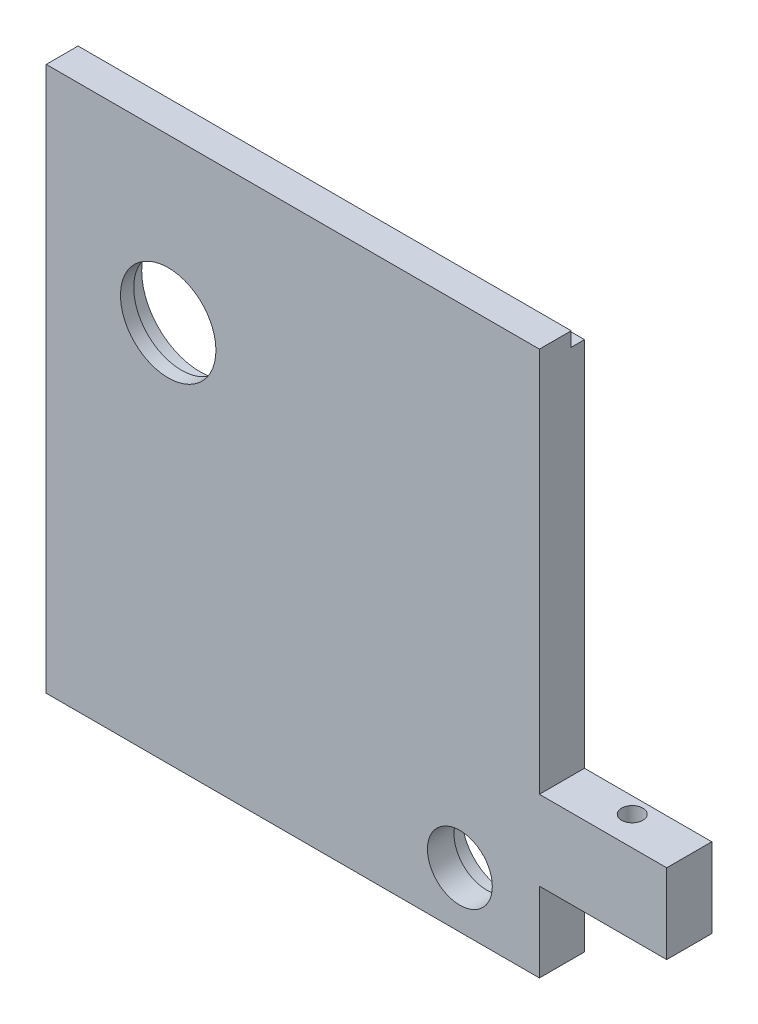
ISO-10303-21;
HEADER;
FILE_DESCRIPTION(('STEP AP214'),'2;1');
FILE_NAME('part.step','',(''),(''),'','','');
FILE_SCHEMA(('AUTOMOTIVE_DESIGN { 1 0 10303 214 1 1 1 1 }'));
ENDSEC;
DATA;
#1=APPLICATION_CONTEXT('core data for automotive mechanical design processes');
#2=APPLICATION_PROTOCOL_DEFINITION('international standard','automotive_design',2000,#1);
#3=PRODUCT_CONTEXT('',#1,'mechanical');
#4=PRODUCT('Part','Part','',(#3));
#5=PRODUCT_RELATED_PRODUCT_CATEGORY('part','',(#4));
#6=PRODUCT_DEFINITION_FORMATION('','',#4);
#7=PRODUCT_DEFINITION_CONTEXT('part definition',#1,'design');
#8=PRODUCT_DEFINITION('design','',#6,#7);
#9=PRODUCT_DEFINITION_SHAPE('','',#8);
#10=(LENGTH_UNIT() NAMED_UNIT(*) SI_UNIT(.MILLI.,.METRE.));
#11=(NAMED_UNIT(*) PLANE_ANGLE_UNIT() SI_UNIT($,.RADIAN.));
#12=(NAMED_UNIT(*) SI_UNIT($,.STERADIAN.) SOLID_ANGLE_UNIT());
#13=UNCERTAINTY_MEASURE_WITH_UNIT(LENGTH_MEASURE(1.E-05),#10,'distance_accuracy_value','');
#14=(GEOMETRIC_REPRESENTATION_CONTEXT(3) GLOBAL_UNCERTAINTY_ASSIGNED_CONTEXT((#13)) GLOBAL_UNIT_ASSIGNED_CONTEXT((#10,
#11,#12)) REPRESENTATION_CONTEXT('',''));
#15=CARTESIAN_POINT('',(0.,0.,0.));
#16=DIRECTION('',(0.,0.,1.));
#17=DIRECTION('',(1.,0.,0.));
#18=AXIS2_PLACEMENT_3D('',#15,#16,#17);
#19=CARTESIAN_POINT('',(1.81294964028777,-24.5719424460432,47.5));
#20=DIRECTION('',(0.,0.,-1.));
#21=DIRECTION('',(-1.,0.,0.));
#22=AXIS2_PLACEMENT_3D('',#19,#20,#21);
#23=CYLINDRICAL_SURFACE('',#22,8.115);
#24=CARTESIAN_POINT('',(1.81294964028777,-24.5719424460432,-2.5));
#25=DIRECTION('',(0.,0.,-1.));
#26=DIRECTION('',(-1.,0.,0.));
#27=AXIS2_PLACEMENT_3D('',#24,#25,#26);
#28=CIRCLE('',#27,8.115);
#29=CARTESIAN_POINT('',(-6.30205035971223,-24.5719424460432,-2.5));
#30=VERTEX_POINT('',#29);
#31=EDGE_CURVE('E310',#30,#30,#28,.T.);
#32=ORIENTED_EDGE('',*,*,#31,.T.);
#33=EDGE_LOOP('',(#32));
#34=FACE_BOUND('',#33,.T.);
#35=CARTESIAN_POINT('',(1.81294964028777,-24.5719424460432,1.));
#36=DIRECTION('',(0.,0.,1.));
#37=DIRECTION('',(1.,0.,0.));
#38=AXIS2_PLACEMENT_3D('',#35,#36,#37);
#39=CIRCLE('',#38,8.115);
#40=CARTESIAN_POINT('',(9.92794964028778,-24.5719424460432,1.));
#41=VERTEX_POINT('',#40);
#42=EDGE_CURVE('E12',#41,#41,#39,.F.);
#43=ORIENTED_EDGE('',*,*,#42,.F.);
#44=EDGE_LOOP('',(#43));
#45=FACE_BOUND('',#44,.T.);
#46=ADVANCED_FACE('F47',(#34,#45),#23,.F.);
#47=CARTESIAN_POINT('',(-53.1870503597122,36.9280575539568,50.));
#48=DIRECTION('',(0.,0.,-1.));
#49=DIRECTION('',(-1.,0.,0.));
#50=AXIS2_PLACEMENT_3D('',#47,#48,#49);
#51=CYLINDRICAL_SURFACE('',#50,11.);
#52=CARTESIAN_POINT('',(-53.1870503597122,36.9280575539568,0.));
#53=DIRECTION('',(0.,0.,-1.));
#54=DIRECTION('',(-1.,0.,0.));
#55=AXIS2_PLACEMENT_3D('',#52,#53,#54);
#56=CIRCLE('',#55,11.);
#57=CARTESIAN_POINT('',(-64.1870503597122,36.9280575539568,0.));
#58=VERTEX_POINT('',#57);
#59=EDGE_CURVE('E313',#58,#58,#56,.T.);
#60=ORIENTED_EDGE('',*,*,#59,.T.);
#61=EDGE_LOOP('',(#60));
#62=FACE_BOUND('',#61,.T.);
#63=CARTESIAN_POINT('',(-53.1870503597122,36.9280575539568,3.5));
#64=DIRECTION('',(0.,0.,1.));
#65=DIRECTION('',(1.,0.,0.));
#66=AXIS2_PLACEMENT_3D('',#63,#64,#65);
#67=CIRCLE('',#66,11.);
#68=CARTESIAN_POINT('',(-42.1870503597123,36.9280575539568,3.5));
#69=VERTEX_POINT('',#68);
#70=EDGE_CURVE('E55',#69,#69,#67,.F.);
#71=ORIENTED_EDGE('',*,*,#70,.F.);
#72=EDGE_LOOP('',(#71));
#73=FACE_BOUND('',#72,.T.);
#74=ADVANCED_FACE('F219',(#62,#73),#51,.F.);
#75=CARTESIAN_POINT('',(16.8129496402878,67.6280575539569,6.));
#76=DIRECTION('',(1.,0.,0.));
#77=DIRECTION('',(0.,1.,0.));
#78=AXIS2_PLACEMENT_3D('',#75,#76,#77);
#79=PLANE('',#78);
#80=DIRECTION('',(0.,0.,1.));
#81=VECTOR('',#80,1.);
#82=CARTESIAN_POINT('',(16.8129496402878,-5.07194244604315,6.));
#83=LINE('',#82,#81);
#84=CARTESIAN_POINT('',(16.8129496402878,-5.07194244604316,-2.5));
#85=VERTEX_POINT('',#84);
#86=CARTESIAN_POINT('',(16.8129496402878,-5.07194244604316,6.));
#87=VERTEX_POINT('',#86);
#88=EDGE_CURVE('E62',#85,#87,#83,.T.);
#89=ORIENTED_EDGE('',*,*,#88,.F.);
#90=DIRECTION('',(0.,-1.,0.));
#91=VECTOR('',#90,1.);
#92=CARTESIAN_POINT('',(16.8129496402878,64.9280575539568,-2.5));
#93=LINE('',#92,#91);
#94=CARTESIAN_POINT('',(16.8129496402878,64.9280575539568,-2.5));
#95=VERTEX_POINT('',#94);
#96=EDGE_CURVE('E165',#95,#85,#93,.T.);
#97=ORIENTED_EDGE('',*,*,#96,.F.);
#98=DIRECTION('',(0.,0.,1.));
#99=VECTOR('',#98,1.);
#100=CARTESIAN_POINT('',(16.8129496402878,64.9280575539568,-2.5));
#101=LINE('',#100,#99);
#102=CARTESIAN_POINT('',(16.8129496402878,64.9280575539568,0.));
#103=VERTEX_POINT('',#102);
#104=EDGE_CURVE('E173',#95,#103,#101,.T.);
#105=ORIENTED_EDGE('',*,*,#104,.T.);
#106=DIRECTION('',(0.,-1.,0.));
#107=VECTOR('',#106,1.);
#108=CARTESIAN_POINT('',(16.8129496402878,67.6280575539569,0.));
#109=LINE('',#108,#107);
#110=CARTESIAN_POINT('',(16.8129496402878,67.6280575539569,0.));
#111=VERTEX_POINT('',#110);
#112=EDGE_CURVE('E202',#111,#103,#109,.T.);
#113=ORIENTED_EDGE('',*,*,#112,.F.);
#114=DIRECTION('',(0.,0.,-1.));
#115=VECTOR('',#114,1.);
#116=CARTESIAN_POINT('',(16.8129496402878,67.6280575539569,6.));
#117=LINE('',#116,#115);
#118=CARTESIAN_POINT('',(16.8129496402878,67.6280575539569,6.));
#119=VERTEX_POINT('',#118);
#120=EDGE_CURVE('E207',#119,#111,#117,.T.);
#121=ORIENTED_EDGE('',*,*,#120,.F.);
#122=DIRECTION('',(0.,-1.,0.));
#123=VECTOR('',#122,1.);
#124=CARTESIAN_POINT('',(16.8129496402878,67.6280575539569,6.));
#125=LINE('',#124,#123);
#126=EDGE_CURVE('E191',#119,#87,#125,.T.);
#127=ORIENTED_EDGE('',*,*,#126,.T.);
#128=EDGE_LOOP('',(#89,#97,#105,#113,#121,#127));
#129=FACE_BOUND('',#128,.T.);
#130=ADVANCED_FACE('F221',(#129),#79,.T.);
#131=CARTESIAN_POINT('',(0.,0.,0.));
#132=DIRECTION('',(0.,0.,1.));
#133=DIRECTION('',(1.,0.,0.));
#134=AXIS2_PLACEMENT_3D('',#131,#132,#133);
#135=PLANE('',#134);
#136=ORIENTED_EDGE('',*,*,#59,.F.);
#137=EDGE_LOOP('',(#136));
#138=FACE_BOUND('',#137,.T.);
#139=DIRECTION('',(1.,0.,0.));
#140=VECTOR('',#139,1.);
#141=CARTESIAN_POINT('',(16.8129496402878,64.9280575539568,0.));
#142=LINE('',#141,#140);
#143=CARTESIAN_POINT('',(-18.1870503597122,64.9280575539568,0.));
#144=VERTEX_POINT('',#143);
#145=EDGE_CURVE('E159',#144,#103,#142,.T.);
#146=ORIENTED_EDGE('',*,*,#145,.F.);
#147=DIRECTION('',(0.,1.,0.));
#148=VECTOR('',#147,1.);
#149=CARTESIAN_POINT('',(-18.1870503597122,64.9280575539568,0.));
#150=LINE('',#149,#148);
#151=CARTESIAN_POINT('',(-18.1870503597123,-35.0719424460432,0.));
#152=VERTEX_POINT('',#151);
#153=EDGE_CURVE('E156',#152,#144,#150,.T.);
#154=ORIENTED_EDGE('',*,*,#153,.F.);
#155=DIRECTION('',(1.,0.,0.));
#156=VECTOR('',#155,1.);
#157=CARTESIAN_POINT('',(-76.1870503597122,-35.0719424460432,0.));
#158=LINE('',#157,#156);
#159=CARTESIAN_POINT('',(-76.1870503597122,-35.0719424460432,0.));
#160=VERTEX_POINT('',#159);
#161=EDGE_CURVE('E199',#160,#152,#158,.T.);
#162=ORIENTED_EDGE('',*,*,#161,.F.);
#163=DIRECTION('',(0.,-1.,0.));
#164=VECTOR('',#163,1.);
#165=CARTESIAN_POINT('',(-76.1870503597122,67.6280575539569,0.));
#166=LINE('',#165,#164);
#167=CARTESIAN_POINT('',(-76.1870503597122,67.6280575539569,0.));
#168=VERTEX_POINT('',#167);
#169=EDGE_CURVE('E185',#168,#160,#166,.T.);
#170=ORIENTED_EDGE('',*,*,#169,.F.);
#171=DIRECTION('',(1.,0.,0.));
#172=VECTOR('',#171,1.);
#173=CARTESIAN_POINT('',(-76.1870503597122,67.6280575539569,0.));
#174=LINE('',#173,#172);
#175=EDGE_CURVE('E189',#168,#111,#174,.T.);
#176=ORIENTED_EDGE('',*,*,#175,.T.);
#177=ORIENTED_EDGE('',*,*,#112,.T.);
#178=EDGE_LOOP('',(#146,#154,#162,#170,#176,#177));
#179=FACE_BOUND('',#178,.T.);
#180=ADVANCED_FACE('F228',(#138,#179),#135,.F.);
#181=CARTESIAN_POINT('',(-76.1870503597122,67.6280575539569,6.));
#182=DIRECTION('',(1.,0.,0.));
#183=DIRECTION('',(0.,1.,0.));
#184=AXIS2_PLACEMENT_3D('',#181,#182,#183);
#185=PLANE('',#184);
#186=ORIENTED_EDGE('',*,*,#169,.T.);
#187=DIRECTION('',(0.,0.,-1.));
#188=VECTOR('',#187,1.);
#189=CARTESIAN_POINT('',(-76.1870503597122,-35.0719424460432,6.));
#190=LINE('',#189,#188);
#191=CARTESIAN_POINT('',(-76.1870503597122,-35.0719424460432,6.));
#192=VERTEX_POINT('',#191);
#193=EDGE_CURVE('E212',#192,#160,#190,.T.);
#194=ORIENTED_EDGE('',*,*,#193,.F.);
#195=DIRECTION('',(0.,-1.,0.));
#196=VECTOR('',#195,1.);
#197=CARTESIAN_POINT('',(-76.1870503597122,67.6280575539569,6.));
#198=LINE('',#197,#196);
#199=CARTESIAN_POINT('',(-76.1870503597122,67.6280575539569,6.));
#200=VERTEX_POINT('',#199);
#201=EDGE_CURVE('E186',#200,#192,#198,.T.);
#202=ORIENTED_EDGE('',*,*,#201,.F.);
#203=DIRECTION('',(0.,0.,-1.));
#204=VECTOR('',#203,1.);
#205=CARTESIAN_POINT('',(-76.1870503597122,67.6280575539569,6.));
#206=LINE('',#205,#204);
#207=EDGE_CURVE('E196',#200,#168,#206,.T.);
#208=ORIENTED_EDGE('',*,*,#207,.T.);
#209=EDGE_LOOP('',(#186,#194,#202,#208));
#210=FACE_BOUND('',#209,.T.);
#211=ADVANCED_FACE('F49',(#210),#185,.F.);
#212=CARTESIAN_POINT('',(-76.1870503597122,-35.0719424460432,6.));
#213=DIRECTION('',(0.,1.,0.));
#214=DIRECTION('',(0.,0.,1.));
#215=AXIS2_PLACEMENT_3D('',#212,#213,#214);
#216=PLANE('',#215);
#217=ORIENTED_EDGE('',*,*,#161,.T.);
#218=DIRECTION('',(0.,0.,1.));
#219=VECTOR('',#218,1.);
#220=CARTESIAN_POINT('',(-18.1870503597123,-35.0719424460432,-2.5));
#221=LINE('',#220,#219);
#222=CARTESIAN_POINT('',(-18.1870503597123,-35.0719424460432,-2.5));
#223=VERTEX_POINT('',#222);
#224=EDGE_CURVE('E182',#223,#152,#221,.T.);
#225=ORIENTED_EDGE('',*,*,#224,.F.);
#226=DIRECTION('',(-1.,0.,0.));
#227=VECTOR('',#226,1.);
#228=CARTESIAN_POINT('',(16.8129496402877,-35.0719424460432,-2.5));
#229=LINE('',#228,#227);
#230=CARTESIAN_POINT('',(16.8129496402877,-35.0719424460432,-2.5));
#231=VERTEX_POINT('',#230);
#232=EDGE_CURVE('E167',#231,#223,#229,.T.);
#233=ORIENTED_EDGE('',*,*,#232,.F.);
#234=DIRECTION('',(0.,0.,-1.));
#235=VECTOR('',#234,1.);
#236=CARTESIAN_POINT('',(16.8129496402878,-35.0719424460432,6.));
#237=LINE('',#236,#235);
#238=CARTESIAN_POINT('',(16.8129496402878,-35.0719424460432,6.));
#239=VERTEX_POINT('',#238);
#240=EDGE_CURVE('E209',#239,#231,#237,.T.);
#241=ORIENTED_EDGE('',*,*,#240,.F.);
#242=DIRECTION('',(1.,0.,0.));
#243=VECTOR('',#242,1.);
#244=CARTESIAN_POINT('',(-76.1870503597122,-35.0719424460432,6.));
#245=LINE('',#244,#243);
#246=EDGE_CURVE('E188',#192,#239,#245,.T.);
#247=ORIENTED_EDGE('',*,*,#246,.F.);
#248=ORIENTED_EDGE('',*,*,#193,.T.);
#249=EDGE_LOOP('',(#217,#225,#233,#241,#247,#248));
#250=FACE_BOUND('',#249,.T.);
#251=ADVANCED_FACE('F271',(#250),#216,.F.);
#252=DIRECTION('',(0.,0.,-1.));
#253=VECTOR('',#252,1.);
#254=CARTESIAN_POINT('',(16.8129496402878,-20.0719424460432,6.));
#255=LINE('',#254,#253);
#256=CARTESIAN_POINT('',(16.8129496402878,-20.0719424460432,6.));
#257=VERTEX_POINT('',#256);
#258=CARTESIAN_POINT('',(16.8129496402878,-20.0719424460432,-2.5));
#259=VERTEX_POINT('',#258);
#260=EDGE_CURVE('E70',#257,#259,#255,.T.);
#261=ORIENTED_EDGE('',*,*,#260,.F.);
#262=EDGE_CURVE('E155',#257,#239,#125,.T.);
#263=ORIENTED_EDGE('',*,*,#262,.T.);
#264=ORIENTED_EDGE('',*,*,#240,.T.);
#265=EDGE_CURVE('E168',#259,#231,#93,.T.);
#266=ORIENTED_EDGE('',*,*,#265,.F.);
#267=EDGE_LOOP('',(#261,#263,#264,#266));
#268=FACE_BOUND('',#267,.T.);
#269=ADVANCED_FACE('F230',(#268),#79,.T.);
#270=CARTESIAN_POINT('',(-76.1870503597122,67.6280575539569,6.));
#271=DIRECTION('',(0.,1.,0.));
#272=DIRECTION('',(0.,0.,1.));
#273=AXIS2_PLACEMENT_3D('',#270,#271,#272);
#274=PLANE('',#273);
#275=ORIENTED_EDGE('',*,*,#175,.F.);
#276=ORIENTED_EDGE('',*,*,#207,.F.);
#277=DIRECTION('',(1.,0.,0.));
#278=VECTOR('',#277,1.);
#279=CARTESIAN_POINT('',(-76.1870503597122,67.6280575539569,6.));
#280=LINE('',#279,#278);
#281=EDGE_CURVE('E193',#200,#119,#280,.T.);
#282=ORIENTED_EDGE('',*,*,#281,.T.);
#283=ORIENTED_EDGE('',*,*,#120,.T.);
#284=EDGE_LOOP('',(#275,#276,#282,#283));
#285=FACE_BOUND('',#284,.T.);
#286=ADVANCED_FACE('F264',(#285),#274,.T.);
#287=CARTESIAN_POINT('',(0.,0.,6.));
#288=DIRECTION('',(0.,0.,1.));
#289=DIRECTION('',(1.,0.,0.));
#290=AXIS2_PLACEMENT_3D('',#287,#288,#289);
#291=PLANE('',#290);
#292=ORIENTED_EDGE('',*,*,#201,.T.);
#293=ORIENTED_EDGE('',*,*,#246,.T.);
#294=ORIENTED_EDGE('',*,*,#262,.F.);
#295=DIRECTION('',(-1.,0.,0.));
#296=VECTOR('',#295,1.);
#297=CARTESIAN_POINT('',(40.8129496402878,-20.0719424460432,6.));
#298=LINE('',#297,#296);
#299=CARTESIAN_POINT('',(40.8129496402878,-20.0719424460432,6.));
#300=VERTEX_POINT('',#299);
#301=EDGE_CURVE('E135',#300,#257,#298,.T.);
#302=ORIENTED_EDGE('',*,*,#301,.F.);
#303=DIRECTION('',(0.,-1.,0.));
#304=VECTOR('',#303,1.);
#305=CARTESIAN_POINT('',(40.8129496402878,-5.07194244604315,6.));
#306=LINE('',#305,#304);
#307=CARTESIAN_POINT('',(40.8129496402878,-5.07194244604315,6.));
#308=VERTEX_POINT('',#307);
#309=EDGE_CURVE('E141',#308,#300,#306,.T.);
#310=ORIENTED_EDGE('',*,*,#309,.F.);
#311=DIRECTION('',(-1.,0.,0.));
#312=VECTOR('',#311,1.);
#313=CARTESIAN_POINT('',(40.8129496402878,-5.07194244604315,6.));
#314=LINE('',#313,#312);
#315=EDGE_CURVE('E297',#308,#87,#314,.T.);
#316=ORIENTED_EDGE('',*,*,#315,.T.);
#317=ORIENTED_EDGE('',*,*,#126,.F.);
#318=ORIENTED_EDGE('',*,*,#281,.F.);
#319=EDGE_LOOP('',(#292,#293,#294,#302,#310,#316,#317,#318));
#320=FACE_BOUND('',#319,.T.);
#321=CARTESIAN_POINT('',(-53.1870503597122,36.9280575539568,6.));
#322=DIRECTION('',(0.,0.,1.));
#323=DIRECTION('',(1.,0.,0.));
#324=AXIS2_PLACEMENT_3D('',#321,#322,#323);
#325=CIRCLE('',#324,8.99999999999999);
#326=CARTESIAN_POINT('',(-44.1870503597123,36.9280575539568,6.));
#327=VERTEX_POINT('',#326);
#328=EDGE_CURVE('E316',#327,#327,#325,.T.);
#329=ORIENTED_EDGE('',*,*,#328,.F.);
#330=EDGE_LOOP('',(#329));
#331=FACE_BOUND('',#330,.T.);
#332=CARTESIAN_POINT('',(1.81294964028777,-24.5719424460432,6.));
#333=DIRECTION('',(0.,0.,1.));
#334=DIRECTION('',(1.,0.,0.));
#335=AXIS2_PLACEMENT_3D('',#332,#333,#334);
#336=CIRCLE('',#335,6.115);
#337=CARTESIAN_POINT('',(7.92794964028778,-24.5719424460432,6.));
#338=VERTEX_POINT('',#337);
#339=EDGE_CURVE('E322',#338,#338,#336,.T.);
#340=ORIENTED_EDGE('',*,*,#339,.F.);
#341=EDGE_LOOP('',(#340));
#342=FACE_BOUND('',#341,.T.);
#343=ADVANCED_FACE('F152',(#320,#331,#342),#291,.T.);
#344=CARTESIAN_POINT('',(-18.1870503597122,64.9280575539568,-2.5));
#345=DIRECTION('',(1.,0.,0.));
#346=DIRECTION('',(0.,1.,0.));
#347=AXIS2_PLACEMENT_3D('',#344,#345,#346);
#348=PLANE('',#347);
#349=ORIENTED_EDGE('',*,*,#153,.T.);
#350=DIRECTION('',(0.,0.,1.));
#351=VECTOR('',#350,1.);
#352=CARTESIAN_POINT('',(-18.1870503597122,64.9280575539568,-2.5));
#353=LINE('',#352,#351);
#354=CARTESIAN_POINT('',(-18.1870503597122,64.9280575539568,-2.5));
#355=VERTEX_POINT('',#354);
#356=EDGE_CURVE('E179',#355,#144,#353,.T.);
#357=ORIENTED_EDGE('',*,*,#356,.F.);
#358=DIRECTION('',(0.,1.,0.));
#359=VECTOR('',#358,1.);
#360=CARTESIAN_POINT('',(-18.1870503597122,64.9280575539568,-2.5));
#361=LINE('',#360,#359);
#362=EDGE_CURVE('E170',#223,#355,#361,.T.);
#363=ORIENTED_EDGE('',*,*,#362,.F.);
#364=ORIENTED_EDGE('',*,*,#224,.T.);
#365=EDGE_LOOP('',(#349,#357,#363,#364));
#366=FACE_BOUND('',#365,.T.);
#367=ADVANCED_FACE('F257',(#366),#348,.F.);
#368=CARTESIAN_POINT('',(16.8129496402878,64.9280575539568,-2.5));
#369=DIRECTION('',(0.,-1.,0.));
#370=DIRECTION('',(0.,0.,-1.));
#371=AXIS2_PLACEMENT_3D('',#368,#369,#370);
#372=PLANE('',#371);
#373=ORIENTED_EDGE('',*,*,#145,.T.);
#374=ORIENTED_EDGE('',*,*,#104,.F.);
#375=DIRECTION('',(1.,0.,0.));
#376=VECTOR('',#375,1.);
#377=CARTESIAN_POINT('',(16.8129496402878,64.9280575539568,-2.5));
#378=LINE('',#377,#376);
#379=EDGE_CURVE('E172',#355,#95,#378,.T.);
#380=ORIENTED_EDGE('',*,*,#379,.F.);
#381=ORIENTED_EDGE('',*,*,#356,.T.);
#382=EDGE_LOOP('',(#373,#374,#380,#381));
#383=FACE_BOUND('',#382,.T.);
#384=ADVANCED_FACE('F253',(#383),#372,.F.);
#385=CARTESIAN_POINT('',(0.,0.,-2.5));
#386=DIRECTION('',(0.,0.,-1.));
#387=DIRECTION('',(-1.,0.,0.));
#388=AXIS2_PLACEMENT_3D('',#385,#386,#387);
#389=PLANE('',#388);
#390=ORIENTED_EDGE('',*,*,#31,.F.);
#391=EDGE_LOOP('',(#390));
#392=FACE_BOUND('',#391,.T.);
#393=ORIENTED_EDGE('',*,*,#96,.T.);
#394=DIRECTION('',(-1.,0.,0.));
#395=VECTOR('',#394,1.);
#396=CARTESIAN_POINT('',(40.8129496402878,-5.07194244604315,-2.5));
#397=LINE('',#396,#395);
#398=CARTESIAN_POINT('',(40.8129496402878,-5.07194244604315,-2.5));
#399=VERTEX_POINT('',#398);
#400=EDGE_CURVE('E161',#399,#85,#397,.T.);
#401=ORIENTED_EDGE('',*,*,#400,.F.);
#402=DIRECTION('',(0.,1.,0.));
#403=VECTOR('',#402,1.);
#404=CARTESIAN_POINT('',(40.8129496402878,-5.07194244604315,-2.5));
#405=LINE('',#404,#403);
#406=CARTESIAN_POINT('',(40.8129496402878,-20.0719424460432,-2.5));
#407=VERTEX_POINT('',#406);
#408=EDGE_CURVE('E140',#407,#399,#405,.T.);
#409=ORIENTED_EDGE('',*,*,#408,.F.);
#410=DIRECTION('',(-1.,0.,0.));
#411=VECTOR('',#410,1.);
#412=CARTESIAN_POINT('',(40.8129496402878,-20.0719424460432,-2.5));
#413=LINE('',#412,#411);
#414=EDGE_CURVE('E137',#407,#259,#413,.T.);
#415=ORIENTED_EDGE('',*,*,#414,.T.);
#416=ORIENTED_EDGE('',*,*,#265,.T.);
#417=ORIENTED_EDGE('',*,*,#232,.T.);
#418=ORIENTED_EDGE('',*,*,#362,.T.);
#419=ORIENTED_EDGE('',*,*,#379,.T.);
#420=EDGE_LOOP('',(#393,#401,#409,#415,#416,#417,#418,#419));
#421=FACE_BOUND('',#420,.T.);
#422=ADVANCED_FACE('F249',(#392,#421),#389,.T.);
#423=CARTESIAN_POINT('',(40.8129496402878,-20.0719424460432,6.));
#424=DIRECTION('',(0.,1.,0.));
#425=DIRECTION('',(-1.,0.,0.));
#426=AXIS2_PLACEMENT_3D('',#423,#424,#425);
#427=PLANE('',#426);
#428=CARTESIAN_POINT('',(28.8129496402878,-20.0719424460432,0.5));
#429=DIRECTION('',(0.,1.,0.));
#430=DIRECTION('',(-1.,0.,0.));
#431=AXIS2_PLACEMENT_3D('',#428,#429,#430);
#432=CIRCLE('',#431,2.);
#433=CARTESIAN_POINT('',(26.8129496402878,-20.0719424460432,0.5));
#434=VERTEX_POINT('',#433);
#435=EDGE_CURVE('E302',#434,#434,#432,.T.);
#436=ORIENTED_EDGE('',*,*,#435,.T.);
#437=EDGE_LOOP('',(#436));
#438=FACE_BOUND('',#437,.T.);
#439=ORIENTED_EDGE('',*,*,#260,.T.);
#440=ORIENTED_EDGE('',*,*,#414,.F.);
#441=DIRECTION('',(0.,0.,-1.));
#442=VECTOR('',#441,1.);
#443=CARTESIAN_POINT('',(40.8129496402878,-20.0719424460432,6.));
#444=LINE('',#443,#442);
#445=EDGE_CURVE('E131',#300,#407,#444,.T.);
#446=ORIENTED_EDGE('',*,*,#445,.F.);
#447=ORIENTED_EDGE('',*,*,#301,.T.);
#448=EDGE_LOOP('',(#439,#440,#446,#447));
#449=FACE_BOUND('',#448,.T.);
#450=ADVANCED_FACE('F133',(#438,#449),#427,.F.);
#451=CARTESIAN_POINT('',(40.8129496402878,-5.07194244604315,6.));
#452=DIRECTION('',(0.,-1.,0.));
#453=DIRECTION('',(1.,0.,0.));
#454=AXIS2_PLACEMENT_3D('',#451,#452,#453);
#455=PLANE('',#454);
#456=CARTESIAN_POINT('',(28.8129496402878,-5.07194244604315,0.5));
#457=DIRECTION('',(0.,1.,0.));
#458=DIRECTION('',(-1.,0.,0.));
#459=AXIS2_PLACEMENT_3D('',#456,#457,#458);
#460=CIRCLE('',#459,2.);
#461=CARTESIAN_POINT('',(26.8129496402878,-5.07194244604315,0.5));
#462=VERTEX_POINT('',#461);
#463=EDGE_CURVE('E307',#462,#462,#460,.T.);
#464=ORIENTED_EDGE('',*,*,#463,.F.);
#465=EDGE_LOOP('',(#464));
#466=FACE_BOUND('',#465,.T.);
#467=ORIENTED_EDGE('',*,*,#88,.T.);
#468=ORIENTED_EDGE('',*,*,#315,.F.);
#469=DIRECTION('',(0.,0.,1.));
#470=VECTOR('',#469,1.);
#471=CARTESIAN_POINT('',(40.8129496402878,-5.07194244604315,6.));
#472=LINE('',#471,#470);
#473=EDGE_CURVE('E146',#399,#308,#472,.T.);
#474=ORIENTED_EDGE('',*,*,#473,.F.);
#475=ORIENTED_EDGE('',*,*,#400,.T.);
#476=EDGE_LOOP('',(#467,#468,#474,#475));
#477=FACE_BOUND('',#476,.T.);
#478=ADVANCED_FACE('F243',(#466,#477),#455,.F.);
#479=CARTESIAN_POINT('',(40.8129496402878,0.,0.));
#480=DIRECTION('',(1.,0.,0.));
#481=DIRECTION('',(0.,0.,-1.));
#482=AXIS2_PLACEMENT_3D('',#479,#480,#481);
#483=PLANE('',#482);
#484=ORIENTED_EDGE('',*,*,#309,.T.);
#485=ORIENTED_EDGE('',*,*,#445,.T.);
#486=ORIENTED_EDGE('',*,*,#408,.T.);
#487=ORIENTED_EDGE('',*,*,#473,.T.);
#488=EDGE_LOOP('',(#484,#485,#486,#487));
#489=FACE_BOUND('',#488,.T.);
#490=ADVANCED_FACE('F144',(#489),#483,.T.);
#491=CARTESIAN_POINT('',(28.8129496402878,-55.0719424460432,0.5));
#492=DIRECTION('',(0.,1.,0.));
#493=DIRECTION('',(-1.,0.,0.));
#494=AXIS2_PLACEMENT_3D('',#491,#492,#493);
#495=CYLINDRICAL_SURFACE('',#494,2.);
#496=ORIENTED_EDGE('',*,*,#463,.T.);
#497=EDGE_LOOP('',(#496));
#498=FACE_BOUND('',#497,.T.);
#499=ORIENTED_EDGE('',*,*,#435,.F.);
#500=EDGE_LOOP('',(#499));
#501=FACE_BOUND('',#500,.T.);
#502=ADVANCED_FACE('F237',(#498,#501),#495,.F.);
#503=CARTESIAN_POINT('',(-53.1870503597122,36.9280575539568,3.5));
#504=DIRECTION('',(0.,0.,1.));
#505=DIRECTION('',(1.,0.,0.));
#506=AXIS2_PLACEMENT_3D('',#503,#504,#505);
#507=PLANE('',#506);
#508=CARTESIAN_POINT('',(-53.1870503597122,36.9280575539568,3.5));
#509=DIRECTION('',(0.,0.,1.));
#510=DIRECTION('',(1.,0.,0.));
#511=AXIS2_PLACEMENT_3D('',#508,#509,#510);
#512=CIRCLE('',#511,8.99999999999999);
#513=CARTESIAN_POINT('',(-44.1870503597123,36.9280575539568,3.5));
#514=VERTEX_POINT('',#513);
#515=EDGE_CURVE('E315',#514,#514,#512,.T.);
#516=ORIENTED_EDGE('',*,*,#515,.T.);
#517=EDGE_LOOP('',(#516));
#518=FACE_BOUND('',#517,.T.);
#519=ORIENTED_EDGE('',*,*,#70,.T.);
#520=EDGE_LOOP('',(#519));
#521=FACE_BOUND('',#520,.T.);
#522=ADVANCED_FACE('F217',(#518,#521),#507,.F.);
#523=CARTESIAN_POINT('',(-53.1870503597122,36.9280575539568,3.5));
#524=DIRECTION('',(0.,0.,1.));
#525=DIRECTION('',(1.,0.,0.));
#526=AXIS2_PLACEMENT_3D('',#523,#524,#525);
#527=CYLINDRICAL_SURFACE('',#526,8.99999999999999);
#528=ORIENTED_EDGE('',*,*,#515,.F.);
#529=EDGE_LOOP('',(#528));
#530=FACE_BOUND('',#529,.T.);
#531=ORIENTED_EDGE('',*,*,#328,.T.);
#532=EDGE_LOOP('',(#531));
#533=FACE_BOUND('',#532,.T.);
#534=ADVANCED_FACE('F340',(#530,#533),#527,.F.);
#535=CARTESIAN_POINT('',(1.81294964028777,-24.5719424460432,1.));
#536=DIRECTION('',(0.,0.,1.));
#537=DIRECTION('',(1.,0.,0.));
#538=AXIS2_PLACEMENT_3D('',#535,#536,#537);
#539=PLANE('',#538);
#540=CARTESIAN_POINT('',(1.81294964028777,-24.5719424460432,1.));
#541=DIRECTION('',(0.,0.,1.));
#542=DIRECTION('',(1.,0.,0.));
#543=AXIS2_PLACEMENT_3D('',#540,#541,#542);
#544=CIRCLE('',#543,6.115);
#545=CARTESIAN_POINT('',(7.92794964028778,-24.5719424460432,1.));
#546=VERTEX_POINT('',#545);
#547=EDGE_CURVE('E319',#546,#546,#544,.T.);
#548=ORIENTED_EDGE('',*,*,#547,.T.);
#549=EDGE_LOOP('',(#548));
#550=FACE_BOUND('',#549,.T.);
#551=ORIENTED_EDGE('',*,*,#42,.T.);
#552=EDGE_LOOP('',(#551));
#553=FACE_BOUND('',#552,.T.);
#554=ADVANCED_FACE('F328',(#550,#553),#539,.F.);
#555=CARTESIAN_POINT('',(1.81294964028777,-24.5719424460432,1.));
#556=DIRECTION('',(0.,0.,1.));
#557=DIRECTION('',(1.,0.,0.));
#558=AXIS2_PLACEMENT_3D('',#555,#556,#557);
#559=CYLINDRICAL_SURFACE('',#558,6.115);
#560=ORIENTED_EDGE('',*,*,#547,.F.);
#561=EDGE_LOOP('',(#560));
#562=FACE_BOUND('',#561,.T.);
#563=ORIENTED_EDGE('',*,*,#339,.T.);
#564=EDGE_LOOP('',(#563));
#565=FACE_BOUND('',#564,.T.);
#566=ADVANCED_FACE('F331',(#562,#565),#559,.F.);
#567=CLOSED_SHELL('',(#46,#74,#130,#180,#211,#251,#269,#286,#343,#367,#384,#422,#450,#478,#490,
#502,#522,#534,#554,#566));
#568=MANIFOLD_SOLID_BREP('B2',#567);
#569=ADVANCED_BREP_SHAPE_REPRESENTATION('',(#18,#568),#14);
#570=SHAPE_DEFINITION_REPRESENTATION(#9,#569);
ENDSEC;
END-ISO-10303-21;
